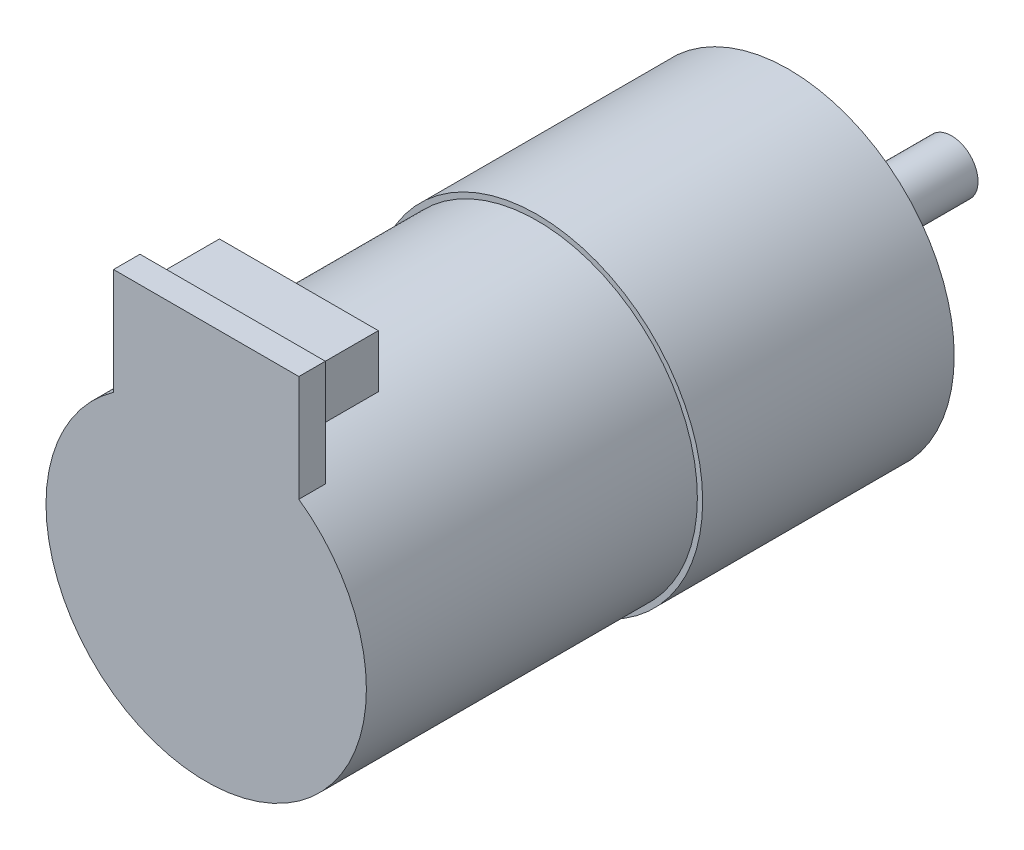
ISO-10303-21;
HEADER;
FILE_DESCRIPTION(('STEP AP214'),'2;1');
FILE_NAME('part.step','',(''),(''),'','','');
FILE_SCHEMA(('AUTOMOTIVE_DESIGN { 1 0 10303 214 1 1 1 1 }'));
ENDSEC;
DATA;
#1=APPLICATION_CONTEXT('core data for automotive mechanical design processes');
#2=APPLICATION_PROTOCOL_DEFINITION('international standard','automotive_design',2000,#1);
#3=PRODUCT_CONTEXT('',#1,'mechanical');
#4=PRODUCT('Part','Part','',(#3));
#5=PRODUCT_RELATED_PRODUCT_CATEGORY('part','',(#4));
#6=PRODUCT_DEFINITION_FORMATION('','',#4);
#7=PRODUCT_DEFINITION_CONTEXT('part definition',#1,'design');
#8=PRODUCT_DEFINITION('design','',#6,#7);
#9=PRODUCT_DEFINITION_SHAPE('','',#8);
#10=(LENGTH_UNIT() NAMED_UNIT(*) SI_UNIT(.MILLI.,.METRE.));
#11=(NAMED_UNIT(*) PLANE_ANGLE_UNIT() SI_UNIT($,.RADIAN.));
#12=(NAMED_UNIT(*) SI_UNIT($,.STERADIAN.) SOLID_ANGLE_UNIT());
#13=UNCERTAINTY_MEASURE_WITH_UNIT(LENGTH_MEASURE(1.E-05),#10,'distance_accuracy_value','');
#14=(GEOMETRIC_REPRESENTATION_CONTEXT(3) GLOBAL_UNCERTAINTY_ASSIGNED_CONTEXT((#13)) GLOBAL_UNIT_ASSIGNED_CONTEXT((#10,
#11,#12)) REPRESENTATION_CONTEXT('',''));
#15=CARTESIAN_POINT('',(0.,0.,0.));
#16=DIRECTION('',(0.,0.,1.));
#17=DIRECTION('',(1.,0.,0.));
#18=AXIS2_PLACEMENT_3D('',#15,#16,#17);
#19=CARTESIAN_POINT('',(0.,0.,42.));
#20=DIRECTION('',(0.,0.,1.));
#21=DIRECTION('',(1.,0.,0.));
#22=AXIS2_PLACEMENT_3D('',#19,#20,#21);
#23=PLANE('',#22);
#24=DIRECTION('',(0.,1.,0.));
#25=VECTOR('',#24,1.);
#26=CARTESIAN_POINT('',(7.,17.9,42.));
#27=LINE('',#26,#25);
#28=CARTESIAN_POINT('',(7.,9.86965044973732,42.));
#29=VERTEX_POINT('',#28);
#30=CARTESIAN_POINT('',(7.,17.9,42.));
#31=VERTEX_POINT('',#30);
#32=EDGE_CURVE('E126',#29,#31,#27,.T.);
#33=ORIENTED_EDGE('',*,*,#32,.F.);
#34=CARTESIAN_POINT('',(0.,0.,42.));
#35=DIRECTION('',(0.,0.,1.));
#36=DIRECTION('',(1.,0.,0.));
#37=AXIS2_PLACEMENT_3D('',#34,#35,#36);
#38=CIRCLE('',#37,12.1);
#39=CARTESIAN_POINT('',(-7.,9.86965044973732,42.));
#40=VERTEX_POINT('',#39);
#41=EDGE_CURVE('E156',#29,#40,#38,.T.);
#42=ORIENTED_EDGE('',*,*,#41,.T.);
#43=DIRECTION('',(0.,-1.,0.));
#44=VECTOR('',#43,1.);
#45=CARTESIAN_POINT('',(-7.,17.9,42.));
#46=LINE('',#45,#44);
#47=CARTESIAN_POINT('',(-7.,17.9,42.));
#48=VERTEX_POINT('',#47);
#49=EDGE_CURVE('E123',#48,#40,#46,.T.);
#50=ORIENTED_EDGE('',*,*,#49,.F.);
#51=DIRECTION('',(-1.,0.,0.));
#52=VECTOR('',#51,1.);
#53=CARTESIAN_POINT('',(-7.,17.9,42.));
#54=LINE('',#53,#52);
#55=EDGE_CURVE('E136',#31,#48,#54,.T.);
#56=ORIENTED_EDGE('',*,*,#55,.F.);
#57=EDGE_LOOP('',(#33,#42,#50,#56));
#58=FACE_BOUND('',#57,.T.);
#59=DIRECTION('',(1.,0.,0.));
#60=VECTOR('',#59,1.);
#61=CARTESIAN_POINT('',(6.,16.9,42.));
#62=LINE('',#61,#60);
#63=CARTESIAN_POINT('',(-6.,16.9,42.));
#64=VERTEX_POINT('',#63);
#65=CARTESIAN_POINT('',(6.,16.9,42.));
#66=VERTEX_POINT('',#65);
#67=EDGE_CURVE('E122',#64,#66,#62,.T.);
#68=ORIENTED_EDGE('',*,*,#67,.F.);
#69=DIRECTION('',(0.,1.,0.));
#70=VECTOR('',#69,1.);
#71=CARTESIAN_POINT('',(-6.,16.9,42.));
#72=LINE('',#71,#70);
#73=CARTESIAN_POINT('',(-6.,12.9,42.));
#74=VERTEX_POINT('',#73);
#75=EDGE_CURVE('E119',#74,#64,#72,.T.);
#76=ORIENTED_EDGE('',*,*,#75,.F.);
#77=DIRECTION('',(-1.,0.,0.));
#78=VECTOR('',#77,1.);
#79=CARTESIAN_POINT('',(6.,12.9,42.));
#80=LINE('',#79,#78);
#81=CARTESIAN_POINT('',(6.,12.9,42.));
#82=VERTEX_POINT('',#81);
#83=EDGE_CURVE('E57',#82,#74,#80,.T.);
#84=ORIENTED_EDGE('',*,*,#83,.F.);
#85=DIRECTION('',(0.,-1.,0.));
#86=VECTOR('',#85,1.);
#87=CARTESIAN_POINT('',(6.,16.9,42.));
#88=LINE('',#87,#86);
#89=EDGE_CURVE('E52',#66,#82,#88,.T.);
#90=ORIENTED_EDGE('',*,*,#89,.F.);
#91=EDGE_LOOP('',(#68,#76,#84,#90));
#92=FACE_BOUND('',#91,.T.);
#93=ADVANCED_FACE('F35',(#58,#92),#23,.F.);
#94=CARTESIAN_POINT('',(0.,0.,19.));
#95=DIRECTION('',(0.,0.,-1.));
#96=DIRECTION('',(-1.,0.,0.));
#97=AXIS2_PLACEMENT_3D('',#94,#95,#96);
#98=CYLINDRICAL_SURFACE('',#97,12.5);
#99=CARTESIAN_POINT('',(0.,0.,19.));
#100=DIRECTION('',(0.,0.,1.));
#101=DIRECTION('',(1.,0.,0.));
#102=AXIS2_PLACEMENT_3D('',#99,#100,#101);
#103=CIRCLE('',#102,12.5);
#104=CARTESIAN_POINT('',(12.5,0.,19.));
#105=VERTEX_POINT('',#104);
#106=EDGE_CURVE('E161',#105,#105,#103,.T.);
#107=ORIENTED_EDGE('',*,*,#106,.F.);
#108=EDGE_LOOP('',(#107));
#109=FACE_BOUND('',#108,.T.);
#110=CARTESIAN_POINT('',(0.,0.,0.));
#111=DIRECTION('',(0.,0.,1.));
#112=DIRECTION('',(1.,0.,0.));
#113=AXIS2_PLACEMENT_3D('',#110,#111,#112);
#114=CIRCLE('',#113,12.5);
#115=CARTESIAN_POINT('',(12.5,0.,0.));
#116=VERTEX_POINT('',#115);
#117=EDGE_CURVE('E158',#116,#116,#114,.T.);
#118=ORIENTED_EDGE('',*,*,#117,.T.);
#119=EDGE_LOOP('',(#118));
#120=FACE_BOUND('',#119,.T.);
#121=ADVANCED_FACE('F37',(#109,#120),#98,.T.);
#122=CARTESIAN_POINT('',(0.,0.,19.));
#123=DIRECTION('',(0.,0.,1.));
#124=DIRECTION('',(1.,0.,0.));
#125=AXIS2_PLACEMENT_3D('',#122,#123,#124);
#126=PLANE('',#125);
#127=CARTESIAN_POINT('',(0.,0.,19.));
#128=DIRECTION('',(0.,0.,1.));
#129=DIRECTION('',(1.,0.,0.));
#130=AXIS2_PLACEMENT_3D('',#127,#128,#129);
#131=CIRCLE('',#130,12.1);
#132=CARTESIAN_POINT('',(12.1,0.,19.));
#133=VERTEX_POINT('',#132);
#134=EDGE_CURVE('E44',#133,#133,#131,.T.);
#135=ORIENTED_EDGE('',*,*,#134,.F.);
#136=EDGE_LOOP('',(#135));
#137=FACE_BOUND('',#136,.T.);
#138=ORIENTED_EDGE('',*,*,#106,.T.);
#139=EDGE_LOOP('',(#138));
#140=FACE_BOUND('',#139,.T.);
#141=ADVANCED_FACE('F170',(#137,#140),#126,.T.);
#142=CARTESIAN_POINT('',(0.,0.,0.));
#143=DIRECTION('',(0.,0.,1.));
#144=DIRECTION('',(1.,0.,0.));
#145=AXIS2_PLACEMENT_3D('',#142,#143,#144);
#146=PLANE('',#145);
#147=CARTESIAN_POINT('',(-10.,0.,0.));
#148=DIRECTION('',(0.,0.,-1.));
#149=DIRECTION('',(-1.,0.,0.));
#150=AXIS2_PLACEMENT_3D('',#147,#148,#149);
#151=CIRCLE('',#150,1.5);
#152=CARTESIAN_POINT('',(-11.5,0.,0.));
#153=VERTEX_POINT('',#152);
#154=EDGE_CURVE('E274',#153,#153,#151,.T.);
#155=ORIENTED_EDGE('',*,*,#154,.F.);
#156=EDGE_LOOP('',(#155));
#157=FACE_BOUND('',#156,.T.);
#158=CARTESIAN_POINT('',(9.99999999999933,5.27192804715275E-13,0.));
#159=DIRECTION('',(0.,0.,-1.));
#160=DIRECTION('',(-1.,0.,0.));
#161=AXIS2_PLACEMENT_3D('',#158,#159,#160);
#162=CIRCLE('',#161,1.5);
#163=CARTESIAN_POINT('',(8.49999999999932,5.27192804715275E-13,0.));
#164=VERTEX_POINT('',#163);
#165=EDGE_CURVE('E284',#164,#164,#162,.T.);
#166=ORIENTED_EDGE('',*,*,#165,.F.);
#167=EDGE_LOOP('',(#166));
#168=FACE_BOUND('',#167,.T.);
#169=CARTESIAN_POINT('',(0.,0.,0.));
#170=DIRECTION('',(0.,0.,-1.));
#171=DIRECTION('',(-1.,0.,0.));
#172=AXIS2_PLACEMENT_3D('',#169,#170,#171);
#173=CIRCLE('',#172,3.5);
#174=CARTESIAN_POINT('',(3.5,0.,0.));
#175=VERTEX_POINT('',#174);
#176=EDGE_CURVE('E11',#175,#175,#173,.T.);
#177=ORIENTED_EDGE('',*,*,#176,.F.);
#178=EDGE_LOOP('',(#177));
#179=FACE_BOUND('',#178,.T.);
#180=ORIENTED_EDGE('',*,*,#117,.F.);
#181=EDGE_LOOP('',(#180));
#182=FACE_BOUND('',#181,.T.);
#183=ADVANCED_FACE('F167',(#157,#168,#179,#182),#146,.F.);
#184=CARTESIAN_POINT('',(0.,0.,42.));
#185=DIRECTION('',(0.,0.,-1.));
#186=DIRECTION('',(-1.,0.,0.));
#187=AXIS2_PLACEMENT_3D('',#184,#185,#186);
#188=CYLINDRICAL_SURFACE('',#187,12.1);
#189=ORIENTED_EDGE('',*,*,#41,.F.);
#190=DIRECTION('',(0.,0.,-1.));
#191=VECTOR('',#190,1.);
#192=CARTESIAN_POINT('',(7.,9.86965044973732,44.));
#193=LINE('',#192,#191);
#194=CARTESIAN_POINT('',(7.,9.86965044973732,44.));
#195=VERTEX_POINT('',#194);
#196=EDGE_CURVE('E150',#195,#29,#193,.T.);
#197=ORIENTED_EDGE('',*,*,#196,.F.);
#198=CARTESIAN_POINT('',(0.,0.,44.));
#199=DIRECTION('',(0.,0.,1.));
#200=DIRECTION('',(1.,0.,0.));
#201=AXIS2_PLACEMENT_3D('',#198,#199,#200);
#202=CIRCLE('',#201,12.1);
#203=CARTESIAN_POINT('',(-7.,9.86965044973732,44.));
#204=VERTEX_POINT('',#203);
#205=EDGE_CURVE('E135',#204,#195,#202,.T.);
#206=ORIENTED_EDGE('',*,*,#205,.F.);
#207=DIRECTION('',(0.,0.,-1.));
#208=VECTOR('',#207,1.);
#209=CARTESIAN_POINT('',(-7.,9.86965044973732,44.));
#210=LINE('',#209,#208);
#211=EDGE_CURVE('E153',#204,#40,#210,.T.);
#212=ORIENTED_EDGE('',*,*,#211,.T.);
#213=EDGE_LOOP('',(#189,#197,#206,#212));
#214=FACE_BOUND('',#213,.T.);
#215=ORIENTED_EDGE('',*,*,#134,.T.);
#216=EDGE_LOOP('',(#215));
#217=FACE_BOUND('',#216,.T.);
#218=ADVANCED_FACE('F169',(#214,#217),#188,.T.);
#219=CARTESIAN_POINT('',(-7.,17.9,44.));
#220=DIRECTION('',(1.,0.,0.));
#221=DIRECTION('',(0.,1.,0.));
#222=AXIS2_PLACEMENT_3D('',#219,#220,#221);
#223=PLANE('',#222);
#224=ORIENTED_EDGE('',*,*,#49,.T.);
#225=ORIENTED_EDGE('',*,*,#211,.F.);
#226=DIRECTION('',(0.,-1.,0.));
#227=VECTOR('',#226,1.);
#228=CARTESIAN_POINT('',(-7.,17.9,44.));
#229=LINE('',#228,#227);
#230=CARTESIAN_POINT('',(-7.,17.9,44.));
#231=VERTEX_POINT('',#230);
#232=EDGE_CURVE('E132',#231,#204,#229,.T.);
#233=ORIENTED_EDGE('',*,*,#232,.F.);
#234=DIRECTION('',(0.,0.,-1.));
#235=VECTOR('',#234,1.);
#236=CARTESIAN_POINT('',(-7.,17.9,44.));
#237=LINE('',#236,#235);
#238=EDGE_CURVE('E141',#231,#48,#237,.T.);
#239=ORIENTED_EDGE('',*,*,#238,.T.);
#240=EDGE_LOOP('',(#224,#225,#233,#239));
#241=FACE_BOUND('',#240,.T.);
#242=ADVANCED_FACE('F176',(#241),#223,.F.);
#243=CARTESIAN_POINT('',(7.,17.9,44.));
#244=DIRECTION('',(-1.,0.,0.));
#245=DIRECTION('',(0.,-1.,0.));
#246=AXIS2_PLACEMENT_3D('',#243,#244,#245);
#247=PLANE('',#246);
#248=ORIENTED_EDGE('',*,*,#32,.T.);
#249=DIRECTION('',(0.,0.,-1.));
#250=VECTOR('',#249,1.);
#251=CARTESIAN_POINT('',(7.,17.9,44.));
#252=LINE('',#251,#250);
#253=CARTESIAN_POINT('',(7.,17.9,44.));
#254=VERTEX_POINT('',#253);
#255=EDGE_CURVE('E147',#254,#31,#252,.T.);
#256=ORIENTED_EDGE('',*,*,#255,.F.);
#257=DIRECTION('',(0.,1.,0.));
#258=VECTOR('',#257,1.);
#259=CARTESIAN_POINT('',(7.,17.9,44.));
#260=LINE('',#259,#258);
#261=EDGE_CURVE('E138',#195,#254,#260,.T.);
#262=ORIENTED_EDGE('',*,*,#261,.F.);
#263=ORIENTED_EDGE('',*,*,#196,.T.);
#264=EDGE_LOOP('',(#248,#256,#262,#263));
#265=FACE_BOUND('',#264,.T.);
#266=ADVANCED_FACE('F198',(#265),#247,.F.);
#267=CARTESIAN_POINT('',(-7.,17.9,44.));
#268=DIRECTION('',(0.,-1.,0.));
#269=DIRECTION('',(0.,0.,-1.));
#270=AXIS2_PLACEMENT_3D('',#267,#268,#269);
#271=PLANE('',#270);
#272=ORIENTED_EDGE('',*,*,#55,.T.);
#273=ORIENTED_EDGE('',*,*,#238,.F.);
#274=DIRECTION('',(-1.,0.,0.));
#275=VECTOR('',#274,1.);
#276=CARTESIAN_POINT('',(-7.,17.9,44.));
#277=LINE('',#276,#275);
#278=EDGE_CURVE('E140',#254,#231,#277,.T.);
#279=ORIENTED_EDGE('',*,*,#278,.F.);
#280=ORIENTED_EDGE('',*,*,#255,.T.);
#281=EDGE_LOOP('',(#272,#273,#279,#280));
#282=FACE_BOUND('',#281,.T.);
#283=ADVANCED_FACE('F195',(#282),#271,.F.);
#284=CARTESIAN_POINT('',(0.,0.,44.));
#285=DIRECTION('',(0.,0.,1.));
#286=DIRECTION('',(1.,0.,0.));
#287=AXIS2_PLACEMENT_3D('',#284,#285,#286);
#288=PLANE('',#287);
#289=ORIENTED_EDGE('',*,*,#232,.T.);
#290=ORIENTED_EDGE('',*,*,#205,.T.);
#291=ORIENTED_EDGE('',*,*,#261,.T.);
#292=ORIENTED_EDGE('',*,*,#278,.T.);
#293=EDGE_LOOP('',(#289,#290,#291,#292));
#294=FACE_BOUND('',#293,.T.);
#295=ADVANCED_FACE('F193',(#294),#288,.T.);
#296=CARTESIAN_POINT('',(6.,16.9,37.));
#297=DIRECTION('',(0.,-1.,0.));
#298=DIRECTION('',(0.,0.,-1.));
#299=AXIS2_PLACEMENT_3D('',#296,#297,#298);
#300=PLANE('',#299);
#301=ORIENTED_EDGE('',*,*,#67,.T.);
#302=DIRECTION('',(0.,0.,1.));
#303=VECTOR('',#302,1.);
#304=CARTESIAN_POINT('',(6.,16.9,37.));
#305=LINE('',#304,#303);
#306=CARTESIAN_POINT('',(6.,16.9,37.));
#307=VERTEX_POINT('',#306);
#308=EDGE_CURVE('E103',#307,#66,#305,.T.);
#309=ORIENTED_EDGE('',*,*,#308,.F.);
#310=DIRECTION('',(1.,0.,0.));
#311=VECTOR('',#310,1.);
#312=CARTESIAN_POINT('',(6.,16.9,37.));
#313=LINE('',#312,#311);
#314=CARTESIAN_POINT('',(-6.,16.9,37.));
#315=VERTEX_POINT('',#314);
#316=EDGE_CURVE('E110',#315,#307,#313,.T.);
#317=ORIENTED_EDGE('',*,*,#316,.F.);
#318=DIRECTION('',(0.,0.,1.));
#319=VECTOR('',#318,1.);
#320=CARTESIAN_POINT('',(-6.,16.9,37.));
#321=LINE('',#320,#319);
#322=EDGE_CURVE('E292',#315,#64,#321,.T.);
#323=ORIENTED_EDGE('',*,*,#322,.T.);
#324=EDGE_LOOP('',(#301,#309,#317,#323));
#325=FACE_BOUND('',#324,.T.);
#326=ADVANCED_FACE('F121',(#325),#300,.F.);
#327=CARTESIAN_POINT('',(6.,16.9,37.));
#328=DIRECTION('',(-1.,0.,0.));
#329=DIRECTION('',(0.,-1.,0.));
#330=AXIS2_PLACEMENT_3D('',#327,#328,#329);
#331=PLANE('',#330);
#332=ORIENTED_EDGE('',*,*,#89,.T.);
#333=DIRECTION('',(0.,0.,1.));
#334=VECTOR('',#333,1.);
#335=CARTESIAN_POINT('',(6.,12.9,37.));
#336=LINE('',#335,#334);
#337=CARTESIAN_POINT('',(6.,12.9,37.));
#338=VERTEX_POINT('',#337);
#339=EDGE_CURVE('E106',#338,#82,#336,.T.);
#340=ORIENTED_EDGE('',*,*,#339,.F.);
#341=DIRECTION('',(0.,-1.,0.));
#342=VECTOR('',#341,1.);
#343=CARTESIAN_POINT('',(6.,16.9,37.));
#344=LINE('',#343,#342);
#345=EDGE_CURVE('E99',#307,#338,#344,.T.);
#346=ORIENTED_EDGE('',*,*,#345,.F.);
#347=ORIENTED_EDGE('',*,*,#308,.T.);
#348=EDGE_LOOP('',(#332,#340,#346,#347));
#349=FACE_BOUND('',#348,.T.);
#350=ADVANCED_FACE('F101',(#349),#331,.F.);
#351=CARTESIAN_POINT('',(6.,12.9,37.));
#352=DIRECTION('',(0.,1.,0.));
#353=DIRECTION('',(0.,0.,1.));
#354=AXIS2_PLACEMENT_3D('',#351,#352,#353);
#355=PLANE('',#354);
#356=ORIENTED_EDGE('',*,*,#83,.T.);
#357=DIRECTION('',(0.,0.,1.));
#358=VECTOR('',#357,1.);
#359=CARTESIAN_POINT('',(-6.,12.9,37.));
#360=LINE('',#359,#358);
#361=CARTESIAN_POINT('',(-6.,12.9,37.));
#362=VERTEX_POINT('',#361);
#363=EDGE_CURVE('E128',#362,#74,#360,.T.);
#364=ORIENTED_EDGE('',*,*,#363,.F.);
#365=DIRECTION('',(-1.,0.,0.));
#366=VECTOR('',#365,1.);
#367=CARTESIAN_POINT('',(6.,12.9,37.));
#368=LINE('',#367,#366);
#369=EDGE_CURVE('E109',#338,#362,#368,.T.);
#370=ORIENTED_EDGE('',*,*,#369,.F.);
#371=ORIENTED_EDGE('',*,*,#339,.T.);
#372=EDGE_LOOP('',(#356,#364,#370,#371));
#373=FACE_BOUND('',#372,.T.);
#374=ADVANCED_FACE('F225',(#373),#355,.F.);
#375=CARTESIAN_POINT('',(-6.,16.9,37.));
#376=DIRECTION('',(1.,0.,0.));
#377=DIRECTION('',(0.,0.,-1.));
#378=AXIS2_PLACEMENT_3D('',#375,#376,#377);
#379=PLANE('',#378);
#380=ORIENTED_EDGE('',*,*,#75,.T.);
#381=ORIENTED_EDGE('',*,*,#322,.F.);
#382=DIRECTION('',(0.,1.,0.));
#383=VECTOR('',#382,1.);
#384=CARTESIAN_POINT('',(-6.,16.9,37.));
#385=LINE('',#384,#383);
#386=EDGE_CURVE('E115',#362,#315,#385,.T.);
#387=ORIENTED_EDGE('',*,*,#386,.F.);
#388=ORIENTED_EDGE('',*,*,#363,.T.);
#389=EDGE_LOOP('',(#380,#381,#387,#388));
#390=FACE_BOUND('',#389,.T.);
#391=ADVANCED_FACE('F230',(#390),#379,.F.);
#392=CARTESIAN_POINT('',(0.,0.,37.));
#393=DIRECTION('',(0.,0.,1.));
#394=DIRECTION('',(1.,0.,0.));
#395=AXIS2_PLACEMENT_3D('',#392,#393,#394);
#396=PLANE('',#395);
#397=ORIENTED_EDGE('',*,*,#316,.T.);
#398=ORIENTED_EDGE('',*,*,#345,.T.);
#399=ORIENTED_EDGE('',*,*,#369,.T.);
#400=ORIENTED_EDGE('',*,*,#386,.T.);
#401=EDGE_LOOP('',(#397,#398,#399,#400));
#402=FACE_BOUND('',#401,.T.);
#403=ADVANCED_FACE('F113',(#402),#396,.F.);
#404=CARTESIAN_POINT('',(0.,0.,-2.7));
#405=DIRECTION('',(0.,0.,1.));
#406=DIRECTION('',(1.,0.,0.));
#407=AXIS2_PLACEMENT_3D('',#404,#405,#406);
#408=CYLINDRICAL_SURFACE('',#407,3.5);
#409=CARTESIAN_POINT('',(0.,0.,-2.7));
#410=DIRECTION('',(0.,0.,-1.));
#411=DIRECTION('',(-1.,0.,0.));
#412=AXIS2_PLACEMENT_3D('',#409,#410,#411);
#413=CIRCLE('',#412,3.5);
#414=CARTESIAN_POINT('',(3.5,0.,-2.7));
#415=VERTEX_POINT('',#414);
#416=EDGE_CURVE('E287',#415,#415,#413,.T.);
#417=CARTESIAN_POINT('',(3.5,0.,-2.7));
#418=CARTESIAN_POINT('',(3.5,0.,-2.671875));
#419=CARTESIAN_POINT('',(3.5,0.,-2.64375));
#420=CARTESIAN_POINT('',(3.5,0.,-2.5875));
#421=CARTESIAN_POINT('',(3.5,0.,-2.559375));
#422=CARTESIAN_POINT('',(3.5,0.,-2.503125));
#423=CARTESIAN_POINT('',(3.5,0.,-2.475));
#424=CARTESIAN_POINT('',(3.5,0.,-2.41875));
#425=CARTESIAN_POINT('',(3.5,0.,-2.390625));
#426=CARTESIAN_POINT('',(3.5,0.,-2.334375));
#427=CARTESIAN_POINT('',(3.5,0.,-2.30625));
#428=CARTESIAN_POINT('',(3.5,0.,-2.25));
#429=CARTESIAN_POINT('',(3.5,0.,-2.221875));
#430=CARTESIAN_POINT('',(3.5,0.,-2.165625));
#431=CARTESIAN_POINT('',(3.5,0.,-2.1375));
#432=CARTESIAN_POINT('',(3.5,0.,-2.08125));
#433=CARTESIAN_POINT('',(3.5,0.,-2.053125));
#434=CARTESIAN_POINT('',(3.5,0.,-1.996875));
#435=CARTESIAN_POINT('',(3.5,0.,-1.96875));
#436=CARTESIAN_POINT('',(3.5,0.,-1.9125));
#437=CARTESIAN_POINT('',(3.5,0.,-1.884375));
#438=CARTESIAN_POINT('',(3.5,0.,-1.828125));
#439=CARTESIAN_POINT('',(3.5,0.,-1.8));
#440=CARTESIAN_POINT('',(3.5,0.,-1.74375));
#441=CARTESIAN_POINT('',(3.5,0.,-1.715625));
#442=CARTESIAN_POINT('',(3.5,0.,-1.659375));
#443=CARTESIAN_POINT('',(3.5,0.,-1.63125));
#444=CARTESIAN_POINT('',(3.5,0.,-1.575));
#445=CARTESIAN_POINT('',(3.5,0.,-1.546875));
#446=CARTESIAN_POINT('',(3.5,0.,-1.490625));
#447=CARTESIAN_POINT('',(3.5,0.,-1.4625));
#448=CARTESIAN_POINT('',(3.5,0.,-1.40625));
#449=CARTESIAN_POINT('',(3.5,0.,-1.378125));
#450=CARTESIAN_POINT('',(3.5,0.,-1.321875));
#451=CARTESIAN_POINT('',(3.5,0.,-1.29375));
#452=CARTESIAN_POINT('',(3.5,0.,-1.2375));
#453=CARTESIAN_POINT('',(3.5,0.,-1.209375));
#454=CARTESIAN_POINT('',(3.5,0.,-1.153125));
#455=CARTESIAN_POINT('',(3.5,0.,-1.125));
#456=CARTESIAN_POINT('',(3.5,0.,-1.06875));
#457=CARTESIAN_POINT('',(3.5,0.,-1.040625));
#458=CARTESIAN_POINT('',(3.5,0.,-0.984375));
#459=CARTESIAN_POINT('',(3.5,0.,-0.956249999999999));
#460=CARTESIAN_POINT('',(3.5,0.,-0.899999999999999));
#461=CARTESIAN_POINT('',(3.5,0.,-0.871875));
#462=CARTESIAN_POINT('',(3.5,0.,-0.815624999999999));
#463=CARTESIAN_POINT('',(3.5,0.,-0.787499999999999));
#464=CARTESIAN_POINT('',(3.5,0.,-0.73125));
#465=CARTESIAN_POINT('',(3.5,0.,-0.703125));
#466=CARTESIAN_POINT('',(3.5,0.,-0.646875));
#467=CARTESIAN_POINT('',(3.5,0.,-0.61875));
#468=CARTESIAN_POINT('',(3.5,0.,-0.5625));
#469=CARTESIAN_POINT('',(3.5,0.,-0.534375));
#470=CARTESIAN_POINT('',(3.5,0.,-0.478125));
#471=CARTESIAN_POINT('',(3.5,0.,-0.45));
#472=CARTESIAN_POINT('',(3.5,0.,-0.39375));
#473=CARTESIAN_POINT('',(3.5,0.,-0.365625));
#474=CARTESIAN_POINT('',(3.5,0.,-0.309375));
#475=CARTESIAN_POINT('',(3.5,0.,-0.28125));
#476=CARTESIAN_POINT('',(3.5,0.,-0.225));
#477=CARTESIAN_POINT('',(3.5,0.,-0.196875));
#478=CARTESIAN_POINT('',(3.5,0.,-0.140625));
#479=CARTESIAN_POINT('',(3.5,0.,-0.1125));
#480=CARTESIAN_POINT('',(3.5,0.,-0.0562499999999997));
#481=CARTESIAN_POINT('',(3.5,0.,-0.0281249999999996));
#482=CARTESIAN_POINT('',(3.5,0.,0.));
#483=B_SPLINE_CURVE_WITH_KNOTS('',3,(#417,#418,#419,#420,#421,#422,#423,#424,#425,#426,#427,
#428,#429,#430,#431,#432,#433,#434,#435,#436,#437,#438,#439,#440,#441,#442,#443,#444,#445,#446,
#447,#448,#449,#450,#451,#452,#453,#454,#455,#456,#457,#458,#459,#460,#461,#462,#463,#464,#465,
#466,#467,#468,#469,#470,#471,#472,#473,#474,#475,#476,#477,#478,#479,#480,#481,#482),
.UNSPECIFIED.,.F.,.F.,(4,2,2,2,2,2,2,2,2,2,2,2,2,2,2,2,2,2,2,2,2,2,2,2,2,2,2,2,2,2,2,2,4),(0.,
0.0843750000000003,0.16875,0.253125,0.3375,0.421875,0.50625,0.590625,0.675,0.759375,0.84375,
0.928125000000001,1.0125,1.096875,1.18125,1.265625,1.35,1.434375,1.51875,1.603125,1.6875,
1.771875,1.85625,1.940625,2.025,2.109375,2.19375,2.278125,2.3625,2.446875,2.53125,2.615625,2.7),.UNSPECIFIED.);
#484=EDGE_CURVE('BSEAM237',#415,#175,#483,.T.);
#485=ORIENTED_EDGE('',*,*,#416,.F.);
#486=ORIENTED_EDGE('',*,*,#176,.T.);
#487=ORIENTED_EDGE('',*,*,#484,.T.);
#488=ORIENTED_EDGE('',*,*,#484,.F.);
#489=EDGE_LOOP('',(#485,#487,#486,#488));
#490=FACE_BOUND('',#489,.T.);
#491=ADVANCED_FACE('F237',(#490),#408,.T.);
#492=CARTESIAN_POINT('',(0.,0.,-2.7));
#493=DIRECTION('',(0.,0.,-1.));
#494=DIRECTION('',(-1.,0.,0.));
#495=AXIS2_PLACEMENT_3D('',#492,#493,#494);
#496=PLANE('',#495);
#497=CARTESIAN_POINT('',(0.,0.,-2.7));
#498=DIRECTION('',(0.,0.,-1.));
#499=DIRECTION('',(-1.,0.,0.));
#500=AXIS2_PLACEMENT_3D('',#497,#498,#499);
#501=CIRCLE('',#500,2.);
#502=CARTESIAN_POINT('',(-2.,0.,-2.7));
#503=VERTEX_POINT('',#502);
#504=EDGE_CURVE('E39',#503,#503,#501,.F.);
#505=ORIENTED_EDGE('',*,*,#504,.T.);
#506=EDGE_LOOP('',(#505));
#507=FACE_BOUND('',#506,.T.);
#508=ORIENTED_EDGE('',*,*,#416,.T.);
#509=EDGE_LOOP('',(#508));
#510=FACE_BOUND('',#509,.T.);
#511=ADVANCED_FACE('F240',(#507,#510),#496,.T.);
#512=CARTESIAN_POINT('',(0.,0.,-12.3));
#513=DIRECTION('',(0.,0.,1.));
#514=DIRECTION('',(1.,0.,0.));
#515=AXIS2_PLACEMENT_3D('',#512,#513,#514);
#516=CYLINDRICAL_SURFACE('',#515,2.);
#517=ORIENTED_EDGE('',*,*,#504,.F.);
#518=EDGE_LOOP('',(#517));
#519=FACE_BOUND('',#518,.T.);
#520=CARTESIAN_POINT('',(0.,0.,-12.3));
#521=DIRECTION('',(0.,0.,-1.));
#522=DIRECTION('',(-1.,0.,0.));
#523=AXIS2_PLACEMENT_3D('',#520,#521,#522);
#524=CIRCLE('',#523,2.);
#525=CARTESIAN_POINT('',(-2.,0.,-12.3));
#526=VERTEX_POINT('',#525);
#527=EDGE_CURVE('E273',#526,#526,#524,.T.);
#528=ORIENTED_EDGE('',*,*,#527,.F.);
#529=EDGE_LOOP('',(#528));
#530=FACE_BOUND('',#529,.T.);
#531=ADVANCED_FACE('F244',(#519,#530),#516,.T.);
#532=CARTESIAN_POINT('',(0.,0.,-12.3));
#533=DIRECTION('',(0.,0.,-1.));
#534=DIRECTION('',(-1.,0.,0.));
#535=AXIS2_PLACEMENT_3D('',#532,#533,#534);
#536=PLANE('',#535);
#537=ORIENTED_EDGE('',*,*,#527,.T.);
#538=EDGE_LOOP('',(#537));
#539=FACE_BOUND('',#538,.T.);
#540=ADVANCED_FACE('F248',(#539),#536,.T.);
#541=CARTESIAN_POINT('',(9.99999999999933,5.27192804715275E-13,5.));
#542=DIRECTION('',(0.,0.,-1.));
#543=DIRECTION('',(-1.,0.,0.));
#544=AXIS2_PLACEMENT_3D('',#541,#542,#543);
#545=CYLINDRICAL_SURFACE('',#544,1.5);
#546=CARTESIAN_POINT('',(9.99999999999933,5.27192804715275E-13,5.));
#547=DIRECTION('',(0.,0.,-1.));
#548=DIRECTION('',(-1.,0.,0.));
#549=AXIS2_PLACEMENT_3D('',#546,#547,#548);
#550=CIRCLE('',#549,1.5);
#551=CARTESIAN_POINT('',(8.49999999999932,5.27192804715275E-13,5.));
#552=VERTEX_POINT('',#551);
#553=EDGE_CURVE('E279',#552,#552,#550,.T.);
#554=ORIENTED_EDGE('',*,*,#553,.F.);
#555=EDGE_LOOP('',(#554));
#556=FACE_BOUND('',#555,.T.);
#557=ORIENTED_EDGE('',*,*,#165,.T.);
#558=EDGE_LOOP('',(#557));
#559=FACE_BOUND('',#558,.T.);
#560=ADVANCED_FACE('F252',(#556,#559),#545,.F.);
#561=CARTESIAN_POINT('',(9.99999999999933,5.27192804715275E-13,5.));
#562=DIRECTION('',(0.,0.,-1.));
#563=DIRECTION('',(-1.,0.,0.));
#564=AXIS2_PLACEMENT_3D('',#561,#562,#563);
#565=PLANE('',#564);
#566=ORIENTED_EDGE('',*,*,#553,.T.);
#567=EDGE_LOOP('',(#566));
#568=FACE_BOUND('',#567,.T.);
#569=ADVANCED_FACE('F256',(#568),#565,.T.);
#570=CARTESIAN_POINT('',(-10.,0.,5.));
#571=DIRECTION('',(0.,0.,-1.));
#572=DIRECTION('',(-1.,0.,0.));
#573=AXIS2_PLACEMENT_3D('',#570,#571,#572);
#574=CYLINDRICAL_SURFACE('',#573,1.5);
#575=CARTESIAN_POINT('',(-10.,0.,5.));
#576=DIRECTION('',(0.,0.,-1.));
#577=DIRECTION('',(-1.,0.,0.));
#578=AXIS2_PLACEMENT_3D('',#575,#576,#577);
#579=CIRCLE('',#578,1.5);
#580=CARTESIAN_POINT('',(-11.5,0.,5.));
#581=VERTEX_POINT('',#580);
#582=EDGE_CURVE('E272',#581,#581,#579,.T.);
#583=ORIENTED_EDGE('',*,*,#582,.F.);
#584=EDGE_LOOP('',(#583));
#585=FACE_BOUND('',#584,.T.);
#586=ORIENTED_EDGE('',*,*,#154,.T.);
#587=EDGE_LOOP('',(#586));
#588=FACE_BOUND('',#587,.T.);
#589=ADVANCED_FACE('F260',(#585,#588),#574,.F.);
#590=CARTESIAN_POINT('',(-10.,0.,5.));
#591=DIRECTION('',(0.,0.,-1.));
#592=DIRECTION('',(-1.,0.,0.));
#593=AXIS2_PLACEMENT_3D('',#590,#591,#592);
#594=PLANE('',#593);
#595=ORIENTED_EDGE('',*,*,#582,.T.);
#596=EDGE_LOOP('',(#595));
#597=FACE_BOUND('',#596,.T.);
#598=ADVANCED_FACE('F264',(#597),#594,.T.);
#599=CLOSED_SHELL('',(#93,#121,#141,#183,#218,#242,#266,#283,#295,#326,#350,#374,#391,#403,#491,
#511,#531,#540,#560,#569,#589,#598));
#600=MANIFOLD_SOLID_BREP('B2',#599);
#601=ADVANCED_BREP_SHAPE_REPRESENTATION('',(#18,#600),#14);
#602=SHAPE_DEFINITION_REPRESENTATION(#9,#601);
ENDSEC;
END-ISO-10303-21;
